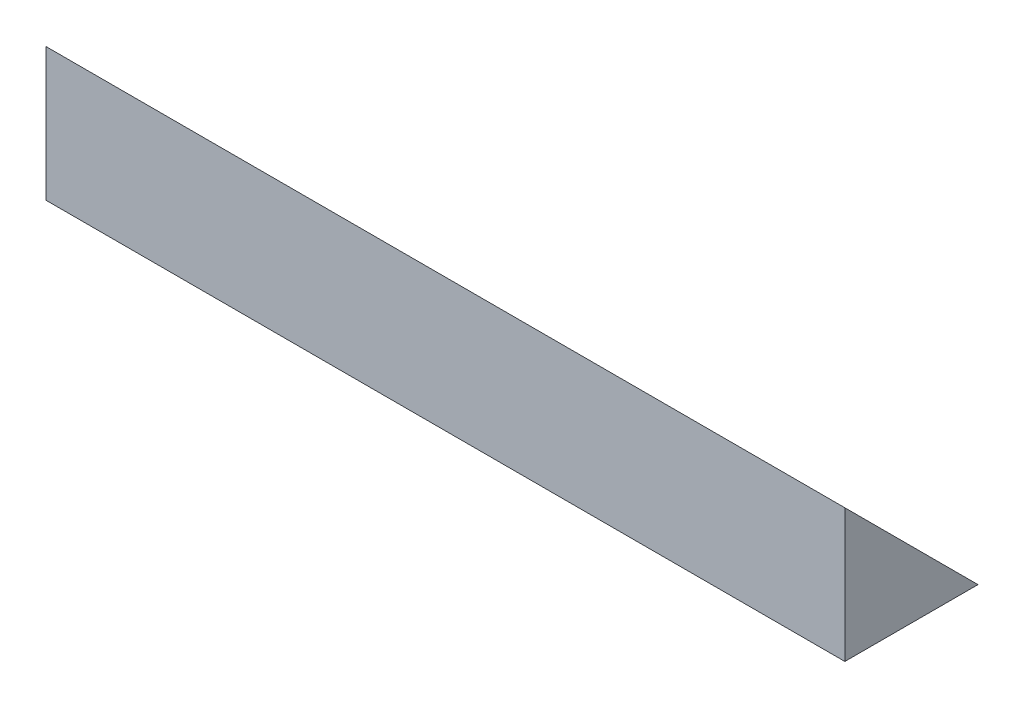
ISO-10303-21;
HEADER;
FILE_DESCRIPTION(('STEP AP214'),'2;1');
FILE_NAME('part.step','',(''),(''),'','','');
FILE_SCHEMA(('AUTOMOTIVE_DESIGN { 1 0 10303 214 1 1 1 1 }'));
ENDSEC;
DATA;
#1=APPLICATION_CONTEXT('core data for automotive mechanical design processes');
#2=APPLICATION_PROTOCOL_DEFINITION('international standard','automotive_design',2000,#1);
#3=PRODUCT_CONTEXT('',#1,'mechanical');
#4=PRODUCT('Part','Part','',(#3));
#5=PRODUCT_RELATED_PRODUCT_CATEGORY('part','',(#4));
#6=PRODUCT_DEFINITION_FORMATION('','',#4);
#7=PRODUCT_DEFINITION_CONTEXT('part definition',#1,'design');
#8=PRODUCT_DEFINITION('design','',#6,#7);
#9=PRODUCT_DEFINITION_SHAPE('','',#8);
#10=(LENGTH_UNIT() NAMED_UNIT(*) SI_UNIT(.MILLI.,.METRE.));
#11=(NAMED_UNIT(*) PLANE_ANGLE_UNIT() SI_UNIT($,.RADIAN.));
#12=(NAMED_UNIT(*) SI_UNIT($,.STERADIAN.) SOLID_ANGLE_UNIT());
#13=UNCERTAINTY_MEASURE_WITH_UNIT(LENGTH_MEASURE(1.E-05),#10,'distance_accuracy_value','');
#14=(GEOMETRIC_REPRESENTATION_CONTEXT(3) GLOBAL_UNCERTAINTY_ASSIGNED_CONTEXT((#13)) GLOBAL_UNIT_ASSIGNED_CONTEXT((#10,
#11,#12)) REPRESENTATION_CONTEXT('',''));
#15=CARTESIAN_POINT('',(0.,0.,0.));
#16=DIRECTION('',(0.,0.,1.));
#17=DIRECTION('',(1.,0.,0.));
#18=AXIS2_PLACEMENT_3D('',#15,#16,#17);
#19=CARTESIAN_POINT('',(1200.,-200.,-200.));
#20=DIRECTION('',(0.,-0.707106781186548,0.707106781186548));
#21=DIRECTION('',(0.,-0.707106781186548,-0.707106781186548));
#22=AXIS2_PLACEMENT_3D('',#19,#20,#21);
#23=PLANE('',#22);
#24=DIRECTION('',(0.,0.707106781186547,0.707106781186547));
#25=VECTOR('',#24,1.);
#26=CARTESIAN_POINT('',(0.,-200.,-200.));
#27=LINE('',#26,#25);
#28=CARTESIAN_POINT('',(0.,-200.,-200.));
#29=VERTEX_POINT('',#28);
#30=CARTESIAN_POINT('',(0.,0.,0.));
#31=VERTEX_POINT('',#30);
#32=EDGE_CURVE('E84',#29,#31,#27,.T.);
#33=ORIENTED_EDGE('',*,*,#32,.T.);
#34=DIRECTION('',(-1.,0.,0.));
#35=VECTOR('',#34,1.);
#36=CARTESIAN_POINT('',(1200.,0.,0.));
#37=LINE('',#36,#35);
#38=CARTESIAN_POINT('',(1200.,0.,0.));
#39=VERTEX_POINT('',#38);
#40=EDGE_CURVE('E11',#39,#31,#37,.T.);
#41=ORIENTED_EDGE('',*,*,#40,.F.);
#42=DIRECTION('',(0.,0.707106781186547,0.707106781186547));
#43=VECTOR('',#42,1.);
#44=CARTESIAN_POINT('',(1200.,-200.,-200.));
#45=LINE('',#44,#43);
#46=CARTESIAN_POINT('',(1200.,-200.,-200.));
#47=VERTEX_POINT('',#46);
#48=EDGE_CURVE('E77',#47,#39,#45,.T.);
#49=ORIENTED_EDGE('',*,*,#48,.F.);
#50=DIRECTION('',(-1.,0.,0.));
#51=VECTOR('',#50,1.);
#52=CARTESIAN_POINT('',(1200.,-200.,-200.));
#53=LINE('',#52,#51);
#54=EDGE_CURVE('E85',#47,#29,#53,.T.);
#55=ORIENTED_EDGE('',*,*,#54,.T.);
#56=EDGE_LOOP('',(#33,#41,#49,#55));
#57=FACE_BOUND('',#56,.T.);
#58=ADVANCED_FACE('F37',(#57),#23,.F.);
#59=CARTESIAN_POINT('',(1200.,0.,0.));
#60=DIRECTION('',(0.,0.,-1.));
#61=DIRECTION('',(-1.,0.,0.));
#62=AXIS2_PLACEMENT_3D('',#59,#60,#61);
#63=PLANE('',#62);
#64=DIRECTION('',(0.,-1.,0.));
#65=VECTOR('',#64,1.);
#66=CARTESIAN_POINT('',(0.,0.,0.));
#67=LINE('',#66,#65);
#68=CARTESIAN_POINT('',(0.,-200.,0.));
#69=VERTEX_POINT('',#68);
#70=EDGE_CURVE('E65',#31,#69,#67,.T.);
#71=ORIENTED_EDGE('',*,*,#70,.T.);
#72=DIRECTION('',(-1.,0.,0.));
#73=VECTOR('',#72,1.);
#74=CARTESIAN_POINT('',(1200.,-200.,0.));
#75=LINE('',#74,#73);
#76=CARTESIAN_POINT('',(1200.,-200.,0.));
#77=VERTEX_POINT('',#76);
#78=EDGE_CURVE('E45',#77,#69,#75,.T.);
#79=ORIENTED_EDGE('',*,*,#78,.F.);
#80=DIRECTION('',(0.,-1.,0.));
#81=VECTOR('',#80,1.);
#82=CARTESIAN_POINT('',(1200.,0.,0.));
#83=LINE('',#82,#81);
#84=EDGE_CURVE('E73',#39,#77,#83,.T.);
#85=ORIENTED_EDGE('',*,*,#84,.F.);
#86=ORIENTED_EDGE('',*,*,#40,.T.);
#87=EDGE_LOOP('',(#71,#79,#85,#86));
#88=FACE_BOUND('',#87,.T.);
#89=ADVANCED_FACE('F74',(#88),#63,.F.);
#90=CARTESIAN_POINT('',(1200.,-200.,0.));
#91=DIRECTION('',(0.,1.,0.));
#92=DIRECTION('',(0.,0.,1.));
#93=AXIS2_PLACEMENT_3D('',#90,#91,#92);
#94=PLANE('',#93);
#95=DIRECTION('',(0.,0.,-1.));
#96=VECTOR('',#95,1.);
#97=CARTESIAN_POINT('',(0.,-200.,0.));
#98=LINE('',#97,#96);
#99=EDGE_CURVE('E70',#69,#29,#98,.T.);
#100=ORIENTED_EDGE('',*,*,#99,.T.);
#101=ORIENTED_EDGE('',*,*,#54,.F.);
#102=DIRECTION('',(0.,0.,-1.));
#103=VECTOR('',#102,1.);
#104=CARTESIAN_POINT('',(1200.,-200.,0.));
#105=LINE('',#104,#103);
#106=EDGE_CURVE('E53',#77,#47,#105,.T.);
#107=ORIENTED_EDGE('',*,*,#106,.F.);
#108=ORIENTED_EDGE('',*,*,#78,.T.);
#109=EDGE_LOOP('',(#100,#101,#107,#108));
#110=FACE_BOUND('',#109,.T.);
#111=ADVANCED_FACE('F92',(#110),#94,.F.);
#112=CARTESIAN_POINT('',(1200.,0.,0.));
#113=DIRECTION('',(1.,0.,0.));
#114=DIRECTION('',(0.,0.,-1.));
#115=AXIS2_PLACEMENT_3D('',#112,#113,#114);
#116=PLANE('',#115);
#117=ORIENTED_EDGE('',*,*,#48,.T.);
#118=ORIENTED_EDGE('',*,*,#84,.T.);
#119=ORIENTED_EDGE('',*,*,#106,.T.);
#120=EDGE_LOOP('',(#117,#118,#119));
#121=FACE_BOUND('',#120,.T.);
#122=ADVANCED_FACE('F80',(#121),#116,.T.);
#123=CARTESIAN_POINT('',(0.,0.,0.));
#124=DIRECTION('',(1.,0.,0.));
#125=DIRECTION('',(0.,0.,-1.));
#126=AXIS2_PLACEMENT_3D('',#123,#124,#125);
#127=PLANE('',#126);
#128=ORIENTED_EDGE('',*,*,#32,.F.);
#129=ORIENTED_EDGE('',*,*,#99,.F.);
#130=ORIENTED_EDGE('',*,*,#70,.F.);
#131=EDGE_LOOP('',(#128,#129,#130));
#132=FACE_BOUND('',#131,.T.);
#133=ADVANCED_FACE('F93',(#132),#127,.F.);
#134=CLOSED_SHELL('',(#58,#89,#111,#122,#133));
#135=MANIFOLD_SOLID_BREP('B2',#134);
#136=ADVANCED_BREP_SHAPE_REPRESENTATION('',(#18,#135),#14);
#137=SHAPE_DEFINITION_REPRESENTATION(#9,#136);
ENDSEC;
END-ISO-10303-21;
